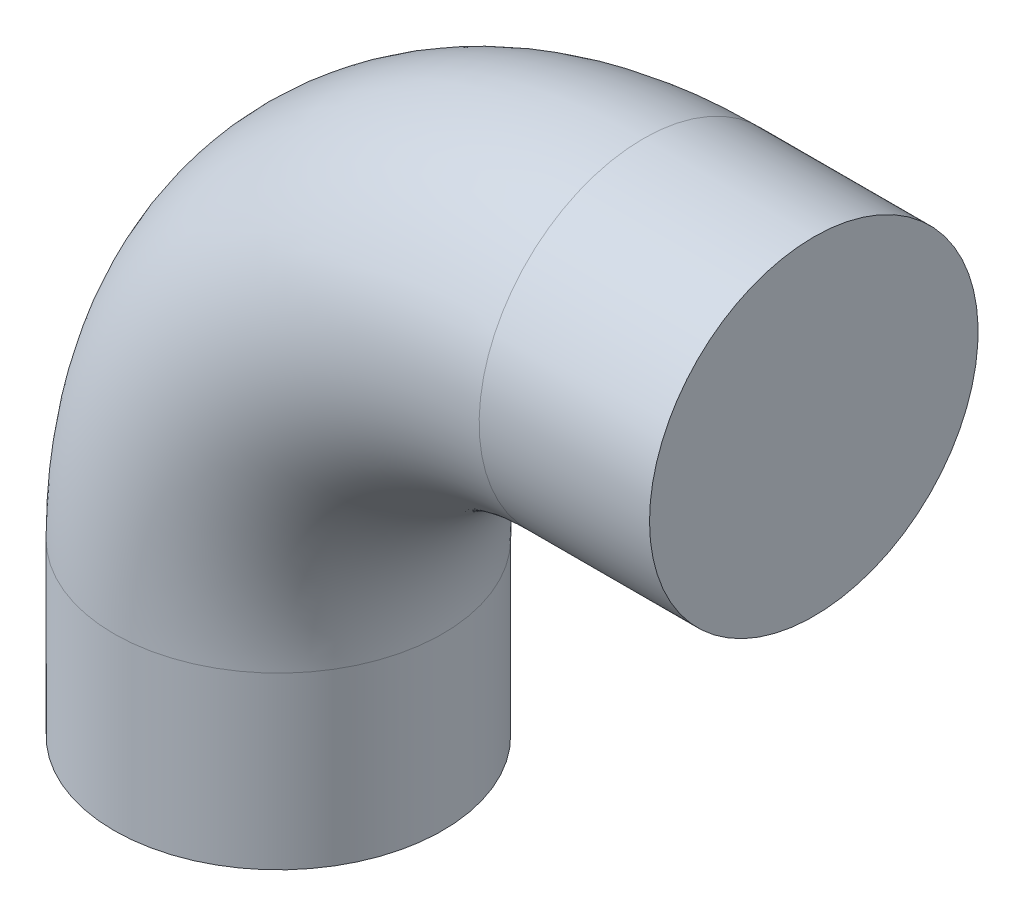
ISO-10303-21;
HEADER;
FILE_DESCRIPTION(('STEP AP214'),'2;1');
FILE_NAME('part.step','',(''),(''),'','','');
FILE_SCHEMA(('AUTOMOTIVE_DESIGN { 1 0 10303 214 1 1 1 1 }'));
ENDSEC;
DATA;
#1=APPLICATION_CONTEXT('core data for automotive mechanical design processes');
#2=APPLICATION_PROTOCOL_DEFINITION('international standard','automotive_design',2000,#1);
#3=PRODUCT_CONTEXT('',#1,'mechanical');
#4=PRODUCT('Part','Part','',(#3));
#5=PRODUCT_RELATED_PRODUCT_CATEGORY('part','',(#4));
#6=PRODUCT_DEFINITION_FORMATION('','',#4);
#7=PRODUCT_DEFINITION_CONTEXT('part definition',#1,'design');
#8=PRODUCT_DEFINITION('design','',#6,#7);
#9=PRODUCT_DEFINITION_SHAPE('','',#8);
#10=(LENGTH_UNIT() NAMED_UNIT(*) SI_UNIT(.MILLI.,.METRE.));
#11=(NAMED_UNIT(*) PLANE_ANGLE_UNIT() SI_UNIT($,.RADIAN.));
#12=(NAMED_UNIT(*) SI_UNIT($,.STERADIAN.) SOLID_ANGLE_UNIT());
#13=UNCERTAINTY_MEASURE_WITH_UNIT(LENGTH_MEASURE(1.E-05),#10,'distance_accuracy_value','');
#14=(GEOMETRIC_REPRESENTATION_CONTEXT(3) GLOBAL_UNCERTAINTY_ASSIGNED_CONTEXT((#13)) GLOBAL_UNIT_ASSIGNED_CONTEXT((#10,
#11,#12)) REPRESENTATION_CONTEXT('',''));
#15=CARTESIAN_POINT('',(0.,0.,0.));
#16=DIRECTION('',(0.,0.,1.));
#17=DIRECTION('',(1.,0.,0.));
#18=AXIS2_PLACEMENT_3D('',#15,#16,#17);
#19=CARTESIAN_POINT('',(0.,0.,0.));
#20=DIRECTION('',(0.,1.,0.));
#21=DIRECTION('',(0.,0.,1.));
#22=AXIS2_PLACEMENT_3D('',#19,#20,#21);
#23=PLANE('',#22);
#24=CARTESIAN_POINT('',(0.,0.,0.));
#25=DIRECTION('',(0.,1.,0.));
#26=DIRECTION('',(0.,0.,1.));
#27=AXIS2_PLACEMENT_3D('',#24,#25,#26);
#28=CIRCLE('',#27,6.75);
#29=CARTESIAN_POINT('',(0.,0.,6.75));
#30=VERTEX_POINT('',#29);
#31=EDGE_CURVE('E44',#30,#30,#28,.T.);
#32=ORIENTED_EDGE('',*,*,#31,.F.);
#33=EDGE_LOOP('',(#32));
#34=FACE_BOUND('',#33,.T.);
#35=ADVANCED_FACE('F32',(#34),#23,.F.);
#36=CARTESIAN_POINT('',(22.,22.,0.));
#37=DIRECTION('',(1.,0.,0.));
#38=DIRECTION('',(0.,0.,1.));
#39=AXIS2_PLACEMENT_3D('',#36,#37,#38);
#40=PLANE('',#39);
#41=CARTESIAN_POINT('',(22.,22.,0.));
#42=DIRECTION('',(1.,0.,0.));
#43=DIRECTION('',(0.,0.,1.));
#44=AXIS2_PLACEMENT_3D('',#41,#42,#43);
#45=CIRCLE('',#44,6.75);
#46=CARTESIAN_POINT('',(22.,22.,6.75));
#47=VERTEX_POINT('',#46);
#48=EDGE_CURVE('E11',#47,#47,#45,.T.);
#49=ORIENTED_EDGE('',*,*,#48,.T.);
#50=EDGE_LOOP('',(#49));
#51=FACE_BOUND('',#50,.T.);
#52=ADVANCED_FACE('F47',(#51),#40,.T.);
#53=CARTESIAN_POINT('',(0.,0.,0.));
#54=DIRECTION('',(0.,1.,0.));
#55=DIRECTION('',(0.,0.,1.));
#56=AXIS2_PLACEMENT_3D('',#53,#54,#55);
#57=CYLINDRICAL_SURFACE('',#56,6.75);
#58=CARTESIAN_POINT('',(0.,7.,0.));
#59=DIRECTION('',(0.,1.,0.));
#60=DIRECTION('',(0.,0.,1.));
#61=AXIS2_PLACEMENT_3D('',#58,#59,#60);
#62=CIRCLE('',#61,6.75);
#63=CARTESIAN_POINT('',(-6.75,7.,0.));
#64=VERTEX_POINT('',#63);
#65=EDGE_CURVE('E57',#64,#64,#62,.T.);
#66=ORIENTED_EDGE('',*,*,#65,.F.);
#67=EDGE_LOOP('',(#66));
#68=FACE_BOUND('',#67,.T.);
#69=ORIENTED_EDGE('',*,*,#31,.T.);
#70=EDGE_LOOP('',(#69));
#71=FACE_BOUND('',#70,.T.);
#72=ADVANCED_FACE('F62',(#68,#71),#57,.T.);
#73=CARTESIAN_POINT('',(15.,7.,0.));
#74=DIRECTION('',(0.,0.,-1.));
#75=DIRECTION('',(-1.,0.,0.));
#76=AXIS2_PLACEMENT_3D('',#73,#74,#75);
#77=TOROIDAL_SURFACE('',#76,15.,6.75);
#78=CARTESIAN_POINT('',(15.,22.,0.));
#79=DIRECTION('',(1.,0.,0.));
#80=DIRECTION('',(0.,0.,1.));
#81=AXIS2_PLACEMENT_3D('',#78,#79,#80);
#82=CIRCLE('',#81,6.75);
#83=CARTESIAN_POINT('',(15.,28.75,0.));
#84=VERTEX_POINT('',#83);
#85=EDGE_CURVE('E39',#84,#84,#82,.T.);
#86=CARTESIAN_POINT('',(15.,7.,0.));
#87=DIRECTION('',(0.,0.,-1.));
#88=DIRECTION('',(-1.,0.,0.));
#89=AXIS2_PLACEMENT_3D('',#86,#87,#88);
#90=CIRCLE('',#89,21.75);
#91=EDGE_CURVE('',#64,#84,#90,.T.);
#92=ORIENTED_EDGE('',*,*,#65,.T.);
#93=ORIENTED_EDGE('',*,*,#85,.F.);
#94=ORIENTED_EDGE('',*,*,#91,.T.);
#95=ORIENTED_EDGE('',*,*,#91,.F.);
#96=EDGE_LOOP('',(#92,#94,#93,#95));
#97=FACE_BOUND('',#96,.T.);
#98=ADVANCED_FACE('F52',(#97),#77,.T.);
#99=CARTESIAN_POINT('',(15.,22.,0.));
#100=DIRECTION('',(1.,0.,0.));
#101=DIRECTION('',(0.,1.,0.));
#102=AXIS2_PLACEMENT_3D('',#99,#100,#101);
#103=CYLINDRICAL_SURFACE('',#102,6.75);
#104=ORIENTED_EDGE('',*,*,#48,.F.);
#105=EDGE_LOOP('',(#104));
#106=FACE_BOUND('',#105,.T.);
#107=ORIENTED_EDGE('',*,*,#85,.T.);
#108=EDGE_LOOP('',(#107));
#109=FACE_BOUND('',#108,.T.);
#110=ADVANCED_FACE('F49',(#106,#109),#103,.T.);
#111=CLOSED_SHELL('',(#35,#52,#72,#98,#110));
#112=MANIFOLD_SOLID_BREP('B2',#111);
#113=ADVANCED_BREP_SHAPE_REPRESENTATION('',(#18,#112),#14);
#114=SHAPE_DEFINITION_REPRESENTATION(#9,#113);
ENDSEC;
END-ISO-10303-21;
